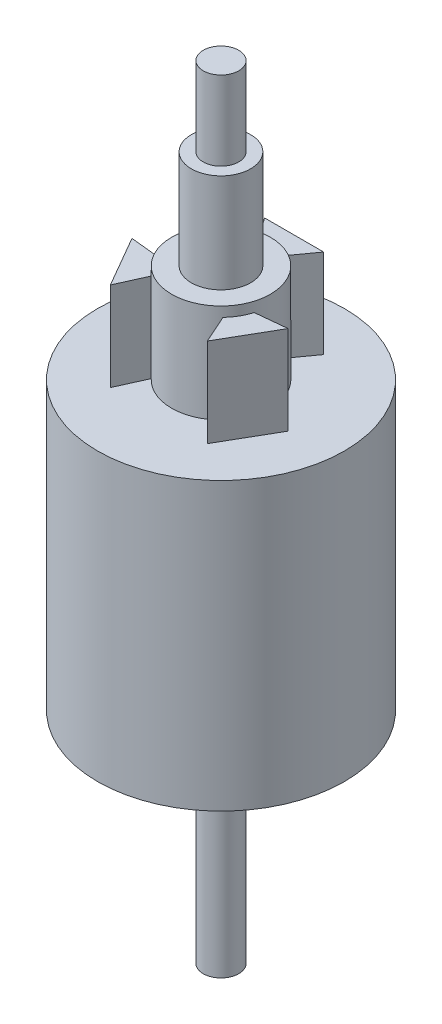
ISO-10303-21;
HEADER;
FILE_DESCRIPTION(('STEP AP214'),'2;1');
FILE_NAME('part.step','',(''),(''),'','','');
FILE_SCHEMA(('AUTOMOTIVE_DESIGN { 1 0 10303 214 1 1 1 1 }'));
ENDSEC;
DATA;
#1=APPLICATION_CONTEXT('core data for automotive mechanical design processes');
#2=APPLICATION_PROTOCOL_DEFINITION('international standard','automotive_design',2000,#1);
#3=PRODUCT_CONTEXT('',#1,'mechanical');
#4=PRODUCT('Part','Part','',(#3));
#5=PRODUCT_RELATED_PRODUCT_CATEGORY('part','',(#4));
#6=PRODUCT_DEFINITION_FORMATION('','',#4);
#7=PRODUCT_DEFINITION_CONTEXT('part definition',#1,'design');
#8=PRODUCT_DEFINITION('design','',#6,#7);
#9=PRODUCT_DEFINITION_SHAPE('','',#8);
#10=(LENGTH_UNIT() NAMED_UNIT(*) SI_UNIT(.MILLI.,.METRE.));
#11=(NAMED_UNIT(*) PLANE_ANGLE_UNIT() SI_UNIT($,.RADIAN.));
#12=(NAMED_UNIT(*) SI_UNIT($,.STERADIAN.) SOLID_ANGLE_UNIT());
#13=UNCERTAINTY_MEASURE_WITH_UNIT(LENGTH_MEASURE(1.E-05),#10,'distance_accuracy_value','');
#14=(GEOMETRIC_REPRESENTATION_CONTEXT(3) GLOBAL_UNCERTAINTY_ASSIGNED_CONTEXT((#13)) GLOBAL_UNIT_ASSIGNED_CONTEXT((#10,
#11,#12)) REPRESENTATION_CONTEXT('',''));
#15=CARTESIAN_POINT('',(0.,0.,0.));
#16=DIRECTION('',(0.,0.,1.));
#17=DIRECTION('',(1.,0.,0.));
#18=AXIS2_PLACEMENT_3D('',#15,#16,#17);
#19=CARTESIAN_POINT('',(0.,14.5,0.));
#20=DIRECTION('',(0.,1.,0.));
#21=DIRECTION('',(0.,0.,1.));
#22=AXIS2_PLACEMENT_3D('',#19,#20,#21);
#23=PLANE('',#22);
#24=CARTESIAN_POINT('',(0.,14.5,0.));
#25=DIRECTION('',(0.,1.,0.));
#26=DIRECTION('',(0.,0.,1.));
#27=AXIS2_PLACEMENT_3D('',#24,#25,#26);
#28=CIRCLE('',#27,6.25);
#29=CARTESIAN_POINT('',(0.,14.5,-6.25));
#30=VERTEX_POINT('',#29);
#31=EDGE_CURVE('E265',#30,#30,#28,.T.);
#32=ORIENTED_EDGE('',*,*,#31,.T.);
#33=EDGE_LOOP('',(#32));
#34=FACE_BOUND('',#33,.T.);
#35=DIRECTION('',(0.499999999999992,0.,-0.866025403784443));
#36=VECTOR('',#35,1.);
#37=CARTESIAN_POINT('',(3.95257779165309,14.5,0.555392899447305));
#38=LINE('',#37,#36);
#39=CARTESIAN_POINT('',(2.45727325582946,14.5,3.14533632828207));
#40=VERTEX_POINT('',#39);
#41=CARTESIAN_POINT('',(3.95257779165309,14.5,0.555392899447305));
#42=VERTEX_POINT('',#41);
#43=EDGE_CURVE('E501',#40,#42,#38,.T.);
#44=ORIENTED_EDGE('',*,*,#43,.F.);
#45=DIRECTION('',(0.409580589376543,0.,0.912273939563092));
#46=VECTOR('',#45,1.);
#47=CARTESIAN_POINT('',(1.81635794236398,14.5,1.71780203318406));
#48=LINE('',#47,#46);
#49=CARTESIAN_POINT('',(1.81635794236398,14.5,1.71780203318406));
#50=VERTEX_POINT('',#49);
#51=EDGE_CURVE('E523',#50,#40,#48,.T.);
#52=ORIENTED_EDGE('',*,*,#51,.F.);
#53=CARTESIAN_POINT('',(0.,14.5,0.));
#54=DIRECTION('',(0.,1.,0.));
#55=DIRECTION('',(0.,0.,1.));
#56=AXIS2_PLACEMENT_3D('',#53,#54,#55);
#57=CIRCLE('',#56,2.5);
#58=CARTESIAN_POINT('',(-1.81635794236396,14.5,1.71780203318409));
#59=VERTEX_POINT('',#58);
#60=EDGE_CURVE('E156',#59,#50,#57,.T.);
#61=ORIENTED_EDGE('',*,*,#60,.F.);
#62=DIRECTION('',(0.40958058937653,0.,-0.912273939563098));
#63=VECTOR('',#62,1.);
#64=CARTESIAN_POINT('',(-1.81635794236396,14.5,1.71780203318409));
#65=LINE('',#64,#63);
#66=CARTESIAN_POINT('',(-2.45727325582942,14.5,3.1453363282821));
#67=VERTEX_POINT('',#66);
#68=EDGE_CURVE('E173',#67,#59,#65,.T.);
#69=ORIENTED_EDGE('',*,*,#68,.F.);
#70=DIRECTION('',(0.500000000000004,0.,0.866025403784436));
#71=VECTOR('',#70,1.);
#72=CARTESIAN_POINT('',(-2.45727325582942,14.5,3.1453363282821));
#73=LINE('',#72,#71);
#74=CARTESIAN_POINT('',(-3.95257779165308,14.5,0.55539289944736));
#75=VERTEX_POINT('',#74);
#76=EDGE_CURVE('E162',#75,#67,#73,.T.);
#77=ORIENTED_EDGE('',*,*,#76,.F.);
#78=DIRECTION('',(-0.994842701560418,0.,-0.101429774484462));
#79=VECTOR('',#78,1.);
#80=CARTESIAN_POINT('',(-2.39583917059195,14.5,0.714111103860797));
#81=LINE('',#80,#79);
#82=CARTESIAN_POINT('',(-2.39583917059195,14.5,0.714111103860797));
#83=VERTEX_POINT('',#82);
#84=EDGE_CURVE('E158',#83,#75,#81,.T.);
#85=ORIENTED_EDGE('',*,*,#84,.F.);
#86=CARTESIAN_POINT('',(-0.579481228227988,14.5,-2.43191313704486));
#87=VERTEX_POINT('',#86);
#88=EDGE_CURVE('E250',#87,#83,#57,.T.);
#89=ORIENTED_EDGE('',*,*,#88,.F.);
#90=DIRECTION('',(0.585262112183883,0.,0.810844165078629));
#91=VECTOR('',#90,1.);
#92=CARTESIAN_POINT('',(-0.579481228227988,14.5,-2.43191313704486));
#93=LINE('',#92,#91);
#94=CARTESIAN_POINT('',(-1.49530453582365,14.5,-3.70072922772943));
#95=VERTEX_POINT('',#94);
#96=EDGE_CURVE('E205',#95,#87,#93,.T.);
#97=ORIENTED_EDGE('',*,*,#96,.F.);
#98=DIRECTION('',(-1.,0.,0.));
#99=VECTOR('',#98,1.);
#100=CARTESIAN_POINT('',(-1.49530453582365,14.5,-3.70072922772943));
#101=LINE('',#100,#99);
#102=CARTESIAN_POINT('',(1.49530453582365,14.5,-3.70072922772943));
#103=VERTEX_POINT('',#102);
#104=EDGE_CURVE('E218',#103,#95,#101,.T.);
#105=ORIENTED_EDGE('',*,*,#104,.F.);
#106=DIRECTION('',(0.585262112183883,0.,-0.810844165078629));
#107=VECTOR('',#106,1.);
#108=CARTESIAN_POINT('',(0.579481228227988,14.5,-2.43191313704486));
#109=LINE('',#108,#107);
#110=CARTESIAN_POINT('',(0.579481228227988,14.5,-2.43191313704486));
#111=VERTEX_POINT('',#110);
#112=EDGE_CURVE('E199',#111,#103,#109,.T.);
#113=ORIENTED_EDGE('',*,*,#112,.F.);
#114=CARTESIAN_POINT('',(2.39583917059196,14.5,0.714111103860764));
#115=VERTEX_POINT('',#114);
#116=EDGE_CURVE('E258',#115,#111,#57,.T.);
#117=ORIENTED_EDGE('',*,*,#116,.F.);
#118=DIRECTION('',(-0.994842701560417,0.,0.101429774484476));
#119=VECTOR('',#118,1.);
#120=CARTESIAN_POINT('',(2.39583917059196,14.5,0.714111103860764));
#121=LINE('',#120,#119);
#122=EDGE_CURVE('E151',#42,#115,#121,.T.);
#123=ORIENTED_EDGE('',*,*,#122,.F.);
#124=EDGE_LOOP('',(#44,#52,#61,#69,#77,#85,#89,#97,#105,#113,#117,#123));
#125=FACE_BOUND('',#124,.T.);
#126=ADVANCED_FACE('F39',(#34,#125),#23,.T.);
#127=CARTESIAN_POINT('',(0.,19.5,0.));
#128=DIRECTION('',(0.,-1.,0.));
#129=DIRECTION('',(0.,0.,-1.));
#130=AXIS2_PLACEMENT_3D('',#127,#128,#129);
#131=CYLINDRICAL_SURFACE('',#130,2.5);
#132=CARTESIAN_POINT('',(0.,19.5,0.));
#133=DIRECTION('',(0.,1.,0.));
#134=DIRECTION('',(0.,0.,1.));
#135=AXIS2_PLACEMENT_3D('',#132,#133,#134);
#136=CIRCLE('',#135,2.5);
#137=CARTESIAN_POINT('',(0.,19.5,2.5));
#138=VERTEX_POINT('',#137);
#139=EDGE_CURVE('E246',#138,#138,#136,.T.);
#140=ORIENTED_EDGE('',*,*,#139,.F.);
#141=EDGE_LOOP('',(#140));
#142=FACE_BOUND('',#141,.T.);
#143=DIRECTION('',(0.,-1.,0.));
#144=VECTOR('',#143,1.);
#145=CARTESIAN_POINT('',(1.81635794236398,19.,1.71780203318406));
#146=LINE('',#145,#144);
#147=CARTESIAN_POINT('',(1.81635794236398,19.,1.71780203318406));
#148=VERTEX_POINT('',#147);
#149=EDGE_CURVE('E136',#148,#50,#146,.T.);
#150=ORIENTED_EDGE('',*,*,#149,.F.);
#151=CARTESIAN_POINT('',(0.,19.,0.));
#152=DIRECTION('',(0.,-1.,0.));
#153=DIRECTION('',(-0.866025403784443,0.,-0.499999999999992));
#154=AXIS2_PLACEMENT_3D('',#151,#152,#153);
#155=CIRCLE('',#154,2.50000000000007);
#156=CARTESIAN_POINT('',(2.39583917059196,19.,0.714111103860764));
#157=VERTEX_POINT('',#156);
#158=EDGE_CURVE('E144',#157,#148,#155,.T.);
#159=ORIENTED_EDGE('',*,*,#158,.F.);
#160=DIRECTION('',(0.,-1.,0.));
#161=VECTOR('',#160,1.);
#162=CARTESIAN_POINT('',(2.39583917059196,19.,0.714111103860764));
#163=LINE('',#162,#161);
#164=EDGE_CURVE('E57',#157,#115,#163,.T.);
#165=ORIENTED_EDGE('',*,*,#164,.T.);
#166=ORIENTED_EDGE('',*,*,#116,.T.);
#167=DIRECTION('',(0.,-1.,0.));
#168=VECTOR('',#167,1.);
#169=CARTESIAN_POINT('',(0.579481228227988,19.,-2.43191313704486));
#170=LINE('',#169,#168);
#171=CARTESIAN_POINT('',(0.579481228227988,19.,-2.43191313704486));
#172=VERTEX_POINT('',#171);
#173=EDGE_CURVE('E234',#172,#111,#170,.T.);
#174=ORIENTED_EDGE('',*,*,#173,.F.);
#175=CARTESIAN_POINT('',(0.,19.,0.));
#176=DIRECTION('',(0.,-1.,0.));
#177=DIRECTION('',(0.,0.,1.));
#178=AXIS2_PLACEMENT_3D('',#175,#176,#177);
#179=CIRCLE('',#178,2.50000000000007);
#180=CARTESIAN_POINT('',(-0.579481228227988,19.,-2.43191313704486));
#181=VERTEX_POINT('',#180);
#182=EDGE_CURVE('E200',#181,#172,#179,.T.);
#183=ORIENTED_EDGE('',*,*,#182,.F.);
#184=DIRECTION('',(0.,-1.,0.));
#185=VECTOR('',#184,1.);
#186=CARTESIAN_POINT('',(-0.579481228227988,19.,-2.43191313704486));
#187=LINE('',#186,#185);
#188=EDGE_CURVE('E215',#181,#87,#187,.T.);
#189=ORIENTED_EDGE('',*,*,#188,.T.);
#190=ORIENTED_EDGE('',*,*,#88,.T.);
#191=DIRECTION('',(0.,-1.,0.));
#192=VECTOR('',#191,1.);
#193=CARTESIAN_POINT('',(-2.39583917059195,19.,0.714111103860797));
#194=LINE('',#193,#192);
#195=CARTESIAN_POINT('',(-2.39583917059195,19.,0.714111103860797));
#196=VERTEX_POINT('',#195);
#197=EDGE_CURVE('E196',#196,#83,#194,.T.);
#198=ORIENTED_EDGE('',*,*,#197,.F.);
#199=CARTESIAN_POINT('',(0.,19.,0.));
#200=DIRECTION('',(0.,-1.,0.));
#201=DIRECTION('',(0.866025403784436,0.,-0.500000000000004));
#202=AXIS2_PLACEMENT_3D('',#199,#200,#201);
#203=CIRCLE('',#202,2.50000000000007);
#204=CARTESIAN_POINT('',(-1.81635794236396,19.,1.71780203318409));
#205=VERTEX_POINT('',#204);
#206=EDGE_CURVE('E168',#205,#196,#203,.T.);
#207=ORIENTED_EDGE('',*,*,#206,.F.);
#208=DIRECTION('',(0.,-1.,0.));
#209=VECTOR('',#208,1.);
#210=CARTESIAN_POINT('',(-1.81635794236396,19.,1.71780203318409));
#211=LINE('',#210,#209);
#212=EDGE_CURVE('E65',#205,#59,#211,.T.);
#213=ORIENTED_EDGE('',*,*,#212,.T.);
#214=ORIENTED_EDGE('',*,*,#60,.T.);
#215=EDGE_LOOP('',(#150,#159,#165,#166,#174,#183,#189,#190,#198,#207,#213,#214));
#216=FACE_BOUND('',#215,.T.);
#217=ADVANCED_FACE('F154',(#142,#216),#131,.T.);
#218=CARTESIAN_POINT('',(0.,14.5,0.));
#219=DIRECTION('',(0.,-1.,0.));
#220=DIRECTION('',(0.,0.,-1.));
#221=AXIS2_PLACEMENT_3D('',#218,#219,#220);
#222=CYLINDRICAL_SURFACE('',#221,6.25);
#223=CARTESIAN_POINT('',(0.,0.,0.));
#224=DIRECTION('',(0.,1.,0.));
#225=DIRECTION('',(0.,0.,1.));
#226=AXIS2_PLACEMENT_3D('',#223,#224,#225);
#227=CIRCLE('',#226,6.25);
#228=CARTESIAN_POINT('',(0.,0.,-6.25));
#229=VERTEX_POINT('',#228);
#230=EDGE_CURVE('E43',#229,#229,#227,.T.);
#231=CARTESIAN_POINT('',(0.,14.5,-6.25));
#232=CARTESIAN_POINT('',(0.,14.3489583333333,-6.25));
#233=CARTESIAN_POINT('',(0.,14.1979166666667,-6.25));
#234=CARTESIAN_POINT('',(0.,13.8958333333333,-6.25));
#235=CARTESIAN_POINT('',(0.,13.7447916666667,-6.25));
#236=CARTESIAN_POINT('',(0.,13.4427083333333,-6.25));
#237=CARTESIAN_POINT('',(0.,13.2916666666667,-6.25));
#238=CARTESIAN_POINT('',(0.,12.9895833333333,-6.25));
#239=CARTESIAN_POINT('',(0.,12.8385416666667,-6.25));
#240=CARTESIAN_POINT('',(0.,12.5364583333333,-6.25));
#241=CARTESIAN_POINT('',(0.,12.3854166666667,-6.25));
#242=CARTESIAN_POINT('',(0.,12.0833333333333,-6.25));
#243=CARTESIAN_POINT('',(0.,11.9322916666667,-6.25));
#244=CARTESIAN_POINT('',(0.,11.6302083333333,-6.25));
#245=CARTESIAN_POINT('',(0.,11.4791666666667,-6.25));
#246=CARTESIAN_POINT('',(0.,11.1770833333333,-6.25));
#247=CARTESIAN_POINT('',(0.,11.0260416666667,-6.25));
#248=CARTESIAN_POINT('',(0.,10.7239583333333,-6.25));
#249=CARTESIAN_POINT('',(0.,10.5729166666667,-6.25));
#250=CARTESIAN_POINT('',(0.,10.2708333333333,-6.25));
#251=CARTESIAN_POINT('',(0.,10.1197916666667,-6.25));
#252=CARTESIAN_POINT('',(0.,9.81770833333333,-6.25));
#253=CARTESIAN_POINT('',(0.,9.66666666666667,-6.25));
#254=CARTESIAN_POINT('',(0.,9.36458333333333,-6.25));
#255=CARTESIAN_POINT('',(0.,9.21354166666667,-6.25));
#256=CARTESIAN_POINT('',(0.,8.91145833333333,-6.25));
#257=CARTESIAN_POINT('',(0.,8.76041666666667,-6.25));
#258=CARTESIAN_POINT('',(0.,8.45833333333333,-6.25));
#259=CARTESIAN_POINT('',(0.,8.30729166666667,-6.25));
#260=CARTESIAN_POINT('',(0.,8.00520833333333,-6.25));
#261=CARTESIAN_POINT('',(0.,7.85416666666667,-6.25));
#262=CARTESIAN_POINT('',(0.,7.55208333333333,-6.25));
#263=CARTESIAN_POINT('',(0.,7.40104166666667,-6.25));
#264=CARTESIAN_POINT('',(0.,7.09895833333333,-6.25));
#265=CARTESIAN_POINT('',(0.,6.94791666666667,-6.25));
#266=CARTESIAN_POINT('',(0.,6.64583333333333,-6.25));
#267=CARTESIAN_POINT('',(0.,6.49479166666667,-6.25));
#268=CARTESIAN_POINT('',(0.,6.19270833333333,-6.25));
#269=CARTESIAN_POINT('',(0.,6.04166666666667,-6.25));
#270=CARTESIAN_POINT('',(0.,5.73958333333333,-6.25));
#271=CARTESIAN_POINT('',(0.,5.58854166666667,-6.25));
#272=CARTESIAN_POINT('',(0.,5.28645833333333,-6.25));
#273=CARTESIAN_POINT('',(0.,5.13541666666667,-6.25));
#274=CARTESIAN_POINT('',(0.,4.83333333333333,-6.25));
#275=CARTESIAN_POINT('',(0.,4.68229166666667,-6.25));
#276=CARTESIAN_POINT('',(0.,4.38020833333333,-6.25));
#277=CARTESIAN_POINT('',(0.,4.22916666666667,-6.25));
#278=CARTESIAN_POINT('',(0.,3.92708333333333,-6.25));
#279=CARTESIAN_POINT('',(0.,3.77604166666667,-6.25));
#280=CARTESIAN_POINT('',(0.,3.47395833333333,-6.25));
#281=CARTESIAN_POINT('',(0.,3.32291666666667,-6.25));
#282=CARTESIAN_POINT('',(0.,3.02083333333333,-6.25));
#283=CARTESIAN_POINT('',(0.,2.86979166666667,-6.25));
#284=CARTESIAN_POINT('',(0.,2.56770833333333,-6.25));
#285=CARTESIAN_POINT('',(0.,2.41666666666667,-6.25));
#286=CARTESIAN_POINT('',(0.,2.11458333333333,-6.25));
#287=CARTESIAN_POINT('',(0.,1.96354166666667,-6.25));
#288=CARTESIAN_POINT('',(0.,1.66145833333333,-6.25));
#289=CARTESIAN_POINT('',(0.,1.51041666666667,-6.25));
#290=CARTESIAN_POINT('',(0.,1.20833333333333,-6.25));
#291=CARTESIAN_POINT('',(0.,1.05729166666667,-6.25));
#292=CARTESIAN_POINT('',(0.,0.755208333333334,-6.25));
#293=CARTESIAN_POINT('',(0.,0.604166666666667,-6.25));
#294=CARTESIAN_POINT('',(0.,0.302083333333333,-6.25));
#295=CARTESIAN_POINT('',(0.,0.151041666666667,-6.25));
#296=CARTESIAN_POINT('',(0.,0.,-6.25));
#297=B_SPLINE_CURVE_WITH_KNOTS('',3,(#231,#232,#233,#234,#235,#236,#237,#238,#239,#240,#241,
#242,#243,#244,#245,#246,#247,#248,#249,#250,#251,#252,#253,#254,#255,#256,#257,#258,#259,#260,
#261,#262,#263,#264,#265,#266,#267,#268,#269,#270,#271,#272,#273,#274,#275,#276,#277,#278,#279,
#280,#281,#282,#283,#284,#285,#286,#287,#288,#289,#290,#291,#292,#293,#294,#295,#296),
.UNSPECIFIED.,.F.,.F.,(4,2,2,2,2,2,2,2,2,2,2,2,2,2,2,2,2,2,2,2,2,2,2,2,2,2,2,2,2,2,2,2,4),(0.,
0.453125,0.906250000000001,1.359375,1.8125,2.265625,2.71875,3.171875,3.625,4.078125,4.53125,
4.984375,5.4375,5.890625,6.34375,6.796875,7.25,7.703125,8.15625,8.609375,9.0625,9.515625,
9.96875,10.421875,10.875,11.328125,11.78125,12.234375,12.6875,13.140625,13.59375,14.046875,
14.5),.UNSPECIFIED.);
#298=EDGE_CURVE('BSEAM41',#30,#229,#297,.T.);
#299=ORIENTED_EDGE('',*,*,#31,.F.);
#300=ORIENTED_EDGE('',*,*,#230,.T.);
#301=ORIENTED_EDGE('',*,*,#298,.T.);
#302=ORIENTED_EDGE('',*,*,#298,.F.);
#303=EDGE_LOOP('',(#299,#301,#300,#302));
#304=FACE_BOUND('',#303,.T.);
#305=ADVANCED_FACE('F41',(#304),#222,.T.);
#306=CARTESIAN_POINT('',(0.,0.,0.));
#307=DIRECTION('',(0.,1.,0.));
#308=DIRECTION('',(0.,0.,1.));
#309=AXIS2_PLACEMENT_3D('',#306,#307,#308);
#310=PLANE('',#309);
#311=CARTESIAN_POINT('',(0.,0.,0.));
#312=DIRECTION('',(0.,1.,0.));
#313=DIRECTION('',(0.,0.,1.));
#314=AXIS2_PLACEMENT_3D('',#311,#312,#313);
#315=CIRCLE('',#314,0.9);
#316=CARTESIAN_POINT('',(0.,0.,0.9));
#317=VERTEX_POINT('',#316);
#318=EDGE_CURVE('E254',#317,#317,#315,.T.);
#319=ORIENTED_EDGE('',*,*,#318,.T.);
#320=EDGE_LOOP('',(#319));
#321=FACE_BOUND('',#320,.T.);
#322=ORIENTED_EDGE('',*,*,#230,.F.);
#323=EDGE_LOOP('',(#322));
#324=FACE_BOUND('',#323,.T.);
#325=ADVANCED_FACE('F276',(#321,#324),#310,.F.);
#326=CARTESIAN_POINT('',(0.,-11.1,0.));
#327=DIRECTION('',(0.,1.,0.));
#328=DIRECTION('',(0.,0.,1.));
#329=AXIS2_PLACEMENT_3D('',#326,#327,#328);
#330=CYLINDRICAL_SURFACE('',#329,0.9);
#331=CARTESIAN_POINT('',(0.,-11.1,0.));
#332=DIRECTION('',(0.,1.,0.));
#333=DIRECTION('',(0.,0.,1.));
#334=AXIS2_PLACEMENT_3D('',#331,#332,#333);
#335=CIRCLE('',#334,0.9);
#336=CARTESIAN_POINT('',(0.,-11.1,0.9));
#337=VERTEX_POINT('',#336);
#338=EDGE_CURVE('E259',#337,#337,#335,.T.);
#339=ORIENTED_EDGE('',*,*,#338,.T.);
#340=EDGE_LOOP('',(#339));
#341=FACE_BOUND('',#340,.T.);
#342=ORIENTED_EDGE('',*,*,#318,.F.);
#343=EDGE_LOOP('',(#342));
#344=FACE_BOUND('',#343,.T.);
#345=ADVANCED_FACE('F278',(#341,#344),#330,.T.);
#346=CARTESIAN_POINT('',(0.,-11.1,0.));
#347=DIRECTION('',(0.,1.,0.));
#348=DIRECTION('',(0.,0.,1.));
#349=AXIS2_PLACEMENT_3D('',#346,#347,#348);
#350=PLANE('',#349);
#351=ORIENTED_EDGE('',*,*,#338,.F.);
#352=EDGE_LOOP('',(#351));
#353=FACE_BOUND('',#352,.T.);
#354=ADVANCED_FACE('F284',(#353),#350,.F.);
#355=CARTESIAN_POINT('',(0.,19.5,0.));
#356=DIRECTION('',(0.,1.,0.));
#357=DIRECTION('',(0.,0.,1.));
#358=AXIS2_PLACEMENT_3D('',#355,#356,#357);
#359=PLANE('',#358);
#360=CARTESIAN_POINT('',(0.,19.5,0.));
#361=DIRECTION('',(0.,1.,0.));
#362=DIRECTION('',(0.,0.,1.));
#363=AXIS2_PLACEMENT_3D('',#360,#361,#362);
#364=CIRCLE('',#363,1.5);
#365=CARTESIAN_POINT('',(0.,19.5,1.5));
#366=VERTEX_POINT('',#365);
#367=EDGE_CURVE('E49',#366,#366,#364,.T.);
#368=ORIENTED_EDGE('',*,*,#367,.F.);
#369=EDGE_LOOP('',(#368));
#370=FACE_BOUND('',#369,.T.);
#371=ORIENTED_EDGE('',*,*,#139,.T.);
#372=EDGE_LOOP('',(#371));
#373=FACE_BOUND('',#372,.T.);
#374=ADVANCED_FACE('F299',(#370,#373),#359,.T.);
#375=CARTESIAN_POINT('',(0.,24.5,0.));
#376=DIRECTION('',(0.,-1.,0.));
#377=DIRECTION('',(0.,0.,-1.));
#378=AXIS2_PLACEMENT_3D('',#375,#376,#377);
#379=CYLINDRICAL_SURFACE('',#378,1.5);
#380=CARTESIAN_POINT('',(0.,24.5,0.));
#381=DIRECTION('',(0.,1.,0.));
#382=DIRECTION('',(0.,0.,1.));
#383=AXIS2_PLACEMENT_3D('',#380,#381,#382);
#384=CIRCLE('',#383,1.5);
#385=CARTESIAN_POINT('',(0.,24.5,1.5));
#386=VERTEX_POINT('',#385);
#387=EDGE_CURVE('E241',#386,#386,#384,.T.);
#388=ORIENTED_EDGE('',*,*,#387,.F.);
#389=EDGE_LOOP('',(#388));
#390=FACE_BOUND('',#389,.T.);
#391=ORIENTED_EDGE('',*,*,#367,.T.);
#392=EDGE_LOOP('',(#391));
#393=FACE_BOUND('',#392,.T.);
#394=ADVANCED_FACE('F304',(#390,#393),#379,.T.);
#395=CARTESIAN_POINT('',(0.,24.5,0.));
#396=DIRECTION('',(0.,1.,0.));
#397=DIRECTION('',(0.,0.,1.));
#398=AXIS2_PLACEMENT_3D('',#395,#396,#397);
#399=PLANE('',#398);
#400=CARTESIAN_POINT('',(0.,24.5,0.));
#401=DIRECTION('',(0.,1.,0.));
#402=DIRECTION('',(0.,0.,1.));
#403=AXIS2_PLACEMENT_3D('',#400,#401,#402);
#404=CIRCLE('',#403,0.9);
#405=CARTESIAN_POINT('',(0.,24.5,0.9));
#406=VERTEX_POINT('',#405);
#407=EDGE_CURVE('E11',#406,#406,#404,.T.);
#408=ORIENTED_EDGE('',*,*,#407,.F.);
#409=EDGE_LOOP('',(#408));
#410=FACE_BOUND('',#409,.T.);
#411=ORIENTED_EDGE('',*,*,#387,.T.);
#412=EDGE_LOOP('',(#411));
#413=FACE_BOUND('',#412,.T.);
#414=ADVANCED_FACE('F308',(#410,#413),#399,.T.);
#415=CARTESIAN_POINT('',(0.,28.5,0.));
#416=DIRECTION('',(0.,-1.,0.));
#417=DIRECTION('',(0.,0.,-1.));
#418=AXIS2_PLACEMENT_3D('',#415,#416,#417);
#419=CYLINDRICAL_SURFACE('',#418,0.9);
#420=CARTESIAN_POINT('',(0.,28.5,0.));
#421=DIRECTION('',(0.,1.,0.));
#422=DIRECTION('',(0.,0.,1.));
#423=AXIS2_PLACEMENT_3D('',#420,#421,#422);
#424=CIRCLE('',#423,0.9);
#425=CARTESIAN_POINT('',(0.,28.5,0.9));
#426=VERTEX_POINT('',#425);
#427=EDGE_CURVE('E238',#426,#426,#424,.T.);
#428=ORIENTED_EDGE('',*,*,#427,.F.);
#429=EDGE_LOOP('',(#428));
#430=FACE_BOUND('',#429,.T.);
#431=ORIENTED_EDGE('',*,*,#407,.T.);
#432=EDGE_LOOP('',(#431));
#433=FACE_BOUND('',#432,.T.);
#434=ADVANCED_FACE('F312',(#430,#433),#419,.T.);
#435=CARTESIAN_POINT('',(0.,28.5,0.));
#436=DIRECTION('',(0.,1.,0.));
#437=DIRECTION('',(0.,0.,1.));
#438=AXIS2_PLACEMENT_3D('',#435,#436,#437);
#439=PLANE('',#438);
#440=ORIENTED_EDGE('',*,*,#427,.T.);
#441=EDGE_LOOP('',(#440));
#442=FACE_BOUND('',#441,.T.);
#443=ADVANCED_FACE('F316',(#442),#439,.T.);
#444=CARTESIAN_POINT('',(0.579481228227988,19.,-2.43191313704486));
#445=DIRECTION('',(-0.810844165078629,0.,-0.585262112183883));
#446=DIRECTION('',(-0.585262112183883,0.,0.810844165078629));
#447=AXIS2_PLACEMENT_3D('',#444,#445,#446);
#448=PLANE('',#447);
#449=ORIENTED_EDGE('',*,*,#112,.T.);
#450=DIRECTION('',(0.,-1.,0.));
#451=VECTOR('',#450,1.);
#452=CARTESIAN_POINT('',(1.49530453582365,19.,-3.70072922772943));
#453=LINE('',#452,#451);
#454=CARTESIAN_POINT('',(1.49530453582365,19.,-3.70072922772943));
#455=VERTEX_POINT('',#454);
#456=EDGE_CURVE('E230',#455,#103,#453,.T.);
#457=ORIENTED_EDGE('',*,*,#456,.F.);
#458=DIRECTION('',(0.585262112183883,0.,-0.810844165078629));
#459=VECTOR('',#458,1.);
#460=CARTESIAN_POINT('',(0.579481228227988,19.,-2.43191313704486));
#461=LINE('',#460,#459);
#462=EDGE_CURVE('E204',#172,#455,#461,.T.);
#463=ORIENTED_EDGE('',*,*,#462,.F.);
#464=ORIENTED_EDGE('',*,*,#173,.T.);
#465=EDGE_LOOP('',(#449,#457,#463,#464));
#466=FACE_BOUND('',#465,.T.);
#467=ADVANCED_FACE('F320',(#466),#448,.F.);
#468=CARTESIAN_POINT('',(-1.49530453582365,19.,-3.70072922772943));
#469=DIRECTION('',(0.,0.,1.));
#470=DIRECTION('',(1.,0.,0.));
#471=AXIS2_PLACEMENT_3D('',#468,#469,#470);
#472=PLANE('',#471);
#473=ORIENTED_EDGE('',*,*,#104,.T.);
#474=DIRECTION('',(0.,-1.,0.));
#475=VECTOR('',#474,1.);
#476=CARTESIAN_POINT('',(-1.49530453582365,19.,-3.70072922772943));
#477=LINE('',#476,#475);
#478=CARTESIAN_POINT('',(-1.49530453582365,19.,-3.70072922772943));
#479=VERTEX_POINT('',#478);
#480=EDGE_CURVE('E226',#479,#95,#477,.T.);
#481=ORIENTED_EDGE('',*,*,#480,.F.);
#482=DIRECTION('',(-1.,0.,0.));
#483=VECTOR('',#482,1.);
#484=CARTESIAN_POINT('',(-1.49530453582365,19.,-3.70072922772943));
#485=LINE('',#484,#483);
#486=EDGE_CURVE('E208',#455,#479,#485,.T.);
#487=ORIENTED_EDGE('',*,*,#486,.F.);
#488=ORIENTED_EDGE('',*,*,#456,.T.);
#489=EDGE_LOOP('',(#473,#481,#487,#488));
#490=FACE_BOUND('',#489,.T.);
#491=ADVANCED_FACE('F324',(#490),#472,.F.);
#492=CARTESIAN_POINT('',(-0.579481228227988,19.,-2.43191313704486));
#493=DIRECTION('',(0.810844165078629,0.,-0.585262112183883));
#494=DIRECTION('',(-0.585262112183883,0.,-0.810844165078629));
#495=AXIS2_PLACEMENT_3D('',#492,#493,#494);
#496=PLANE('',#495);
#497=ORIENTED_EDGE('',*,*,#96,.T.);
#498=ORIENTED_EDGE('',*,*,#188,.F.);
#499=DIRECTION('',(0.585262112183883,0.,0.810844165078629));
#500=VECTOR('',#499,1.);
#501=CARTESIAN_POINT('',(-0.579481228227988,19.,-2.43191313704486));
#502=LINE('',#501,#500);
#503=EDGE_CURVE('E211',#479,#181,#502,.T.);
#504=ORIENTED_EDGE('',*,*,#503,.F.);
#505=ORIENTED_EDGE('',*,*,#480,.T.);
#506=EDGE_LOOP('',(#497,#498,#504,#505));
#507=FACE_BOUND('',#506,.T.);
#508=ADVANCED_FACE('F328',(#507),#496,.F.);
#509=CARTESIAN_POINT('',(0.,19.,0.));
#510=DIRECTION('',(0.,1.,0.));
#511=DIRECTION('',(0.,0.,1.));
#512=AXIS2_PLACEMENT_3D('',#509,#510,#511);
#513=PLANE('',#512);
#514=ORIENTED_EDGE('',*,*,#182,.T.);
#515=ORIENTED_EDGE('',*,*,#462,.T.);
#516=ORIENTED_EDGE('',*,*,#486,.T.);
#517=ORIENTED_EDGE('',*,*,#503,.T.);
#518=EDGE_LOOP('',(#514,#515,#516,#517));
#519=FACE_BOUND('',#518,.T.);
#520=ADVANCED_FACE('F332',(#519),#513,.T.);
#521=CARTESIAN_POINT('',(-2.39583917059195,19.,0.714111103860797));
#522=DIRECTION('',(-0.101429774484462,0.,0.994842701560418));
#523=DIRECTION('',(0.994842701560418,0.,0.101429774484462));
#524=AXIS2_PLACEMENT_3D('',#521,#522,#523);
#525=PLANE('',#524);
#526=ORIENTED_EDGE('',*,*,#84,.T.);
#527=DIRECTION('',(0.,-1.,0.));
#528=VECTOR('',#527,1.);
#529=CARTESIAN_POINT('',(-3.95257779165308,19.,0.55539289944736));
#530=LINE('',#529,#528);
#531=CARTESIAN_POINT('',(-3.95257779165308,19.,0.55539289944736));
#532=VERTEX_POINT('',#531);
#533=EDGE_CURVE('E192',#532,#75,#530,.T.);
#534=ORIENTED_EDGE('',*,*,#533,.F.);
#535=DIRECTION('',(-0.994842701560418,0.,-0.101429774484462));
#536=VECTOR('',#535,1.);
#537=CARTESIAN_POINT('',(-2.39583917059195,19.,0.714111103860797));
#538=LINE('',#537,#536);
#539=EDGE_CURVE('E172',#196,#532,#538,.T.);
#540=ORIENTED_EDGE('',*,*,#539,.F.);
#541=ORIENTED_EDGE('',*,*,#197,.T.);
#542=EDGE_LOOP('',(#526,#534,#540,#541));
#543=FACE_BOUND('',#542,.T.);
#544=ADVANCED_FACE('F336',(#543),#525,.F.);
#545=CARTESIAN_POINT('',(-2.45727325582942,19.,3.1453363282821));
#546=DIRECTION('',(0.866025403784436,0.,-0.500000000000004));
#547=DIRECTION('',(-0.500000000000004,0.,-0.866025403784436));
#548=AXIS2_PLACEMENT_3D('',#545,#546,#547);
#549=PLANE('',#548);
#550=ORIENTED_EDGE('',*,*,#76,.T.);
#551=DIRECTION('',(0.,-1.,0.));
#552=VECTOR('',#551,1.);
#553=CARTESIAN_POINT('',(-2.45727325582942,19.,3.1453363282821));
#554=LINE('',#553,#552);
#555=CARTESIAN_POINT('',(-2.45727325582942,19.,3.1453363282821));
#556=VERTEX_POINT('',#555);
#557=EDGE_CURVE('E188',#556,#67,#554,.T.);
#558=ORIENTED_EDGE('',*,*,#557,.F.);
#559=DIRECTION('',(0.500000000000004,0.,0.866025403784436));
#560=VECTOR('',#559,1.);
#561=CARTESIAN_POINT('',(-2.45727325582942,19.,3.1453363282821));
#562=LINE('',#561,#560);
#563=EDGE_CURVE('E176',#532,#556,#562,.T.);
#564=ORIENTED_EDGE('',*,*,#563,.F.);
#565=ORIENTED_EDGE('',*,*,#533,.T.);
#566=EDGE_LOOP('',(#550,#558,#564,#565));
#567=FACE_BOUND('',#566,.T.);
#568=ADVANCED_FACE('F340',(#567),#549,.F.);
#569=CARTESIAN_POINT('',(-1.81635794236396,19.,1.71780203318409));
#570=DIRECTION('',(-0.912273939563098,0.,-0.40958058937653));
#571=DIRECTION('',(-0.40958058937653,0.,0.912273939563098));
#572=AXIS2_PLACEMENT_3D('',#569,#570,#571);
#573=PLANE('',#572);
#574=ORIENTED_EDGE('',*,*,#68,.T.);
#575=ORIENTED_EDGE('',*,*,#212,.F.);
#576=DIRECTION('',(0.40958058937653,0.,-0.912273939563098));
#577=VECTOR('',#576,1.);
#578=CARTESIAN_POINT('',(-1.81635794236396,19.,1.71780203318409));
#579=LINE('',#578,#577);
#580=EDGE_CURVE('E179',#556,#205,#579,.T.);
#581=ORIENTED_EDGE('',*,*,#580,.F.);
#582=ORIENTED_EDGE('',*,*,#557,.T.);
#583=EDGE_LOOP('',(#574,#575,#581,#582));
#584=FACE_BOUND('',#583,.T.);
#585=ADVANCED_FACE('F344',(#584),#573,.F.);
#586=CARTESIAN_POINT('',(0.,19.,0.));
#587=DIRECTION('',(0.,1.,0.));
#588=DIRECTION('',(0.866025403784436,0.,-0.500000000000004));
#589=AXIS2_PLACEMENT_3D('',#586,#587,#588);
#590=PLANE('',#589);
#591=ORIENTED_EDGE('',*,*,#206,.T.);
#592=ORIENTED_EDGE('',*,*,#539,.T.);
#593=ORIENTED_EDGE('',*,*,#563,.T.);
#594=ORIENTED_EDGE('',*,*,#580,.T.);
#595=EDGE_LOOP('',(#591,#592,#593,#594));
#596=FACE_BOUND('',#595,.T.);
#597=ADVANCED_FACE('F348',(#596),#590,.T.);
#598=CARTESIAN_POINT('',(1.81635794236398,19.,1.71780203318406));
#599=DIRECTION('',(0.912273939563092,0.,-0.409580589376543));
#600=DIRECTION('',(-0.409580589376543,0.,-0.912273939563092));
#601=AXIS2_PLACEMENT_3D('',#598,#599,#600);
#602=PLANE('',#601);
#603=ORIENTED_EDGE('',*,*,#51,.T.);
#604=DIRECTION('',(0.,-1.,0.));
#605=VECTOR('',#604,1.);
#606=CARTESIAN_POINT('',(2.45727325582946,19.,3.14533632828207));
#607=LINE('',#606,#605);
#608=CARTESIAN_POINT('',(2.45727325582946,19.,3.14533632828207));
#609=VERTEX_POINT('',#608);
#610=EDGE_CURVE('E139',#609,#40,#607,.T.);
#611=ORIENTED_EDGE('',*,*,#610,.F.);
#612=DIRECTION('',(0.409580589376543,0.,0.912273939563092));
#613=VECTOR('',#612,1.);
#614=CARTESIAN_POINT('',(1.81635794236398,19.,1.71780203318406));
#615=LINE('',#614,#613);
#616=EDGE_CURVE('E132',#148,#609,#615,.T.);
#617=ORIENTED_EDGE('',*,*,#616,.F.);
#618=ORIENTED_EDGE('',*,*,#149,.T.);
#619=EDGE_LOOP('',(#603,#611,#617,#618));
#620=FACE_BOUND('',#619,.T.);
#621=ADVANCED_FACE('F134',(#620),#602,.F.);
#622=CARTESIAN_POINT('',(3.95257779165309,19.,0.555392899447305));
#623=DIRECTION('',(-0.866025403784443,0.,-0.499999999999992));
#624=DIRECTION('',(-0.499999999999992,0.,0.866025403784443));
#625=AXIS2_PLACEMENT_3D('',#622,#623,#624);
#626=PLANE('',#625);
#627=ORIENTED_EDGE('',*,*,#43,.T.);
#628=DIRECTION('',(0.,-1.,0.));
#629=VECTOR('',#628,1.);
#630=CARTESIAN_POINT('',(3.95257779165309,19.,0.555392899447305));
#631=LINE('',#630,#629);
#632=CARTESIAN_POINT('',(3.95257779165309,19.,0.555392899447305));
#633=VERTEX_POINT('',#632);
#634=EDGE_CURVE('E164',#633,#42,#631,.T.);
#635=ORIENTED_EDGE('',*,*,#634,.F.);
#636=DIRECTION('',(0.499999999999992,0.,-0.866025403784443));
#637=VECTOR('',#636,1.);
#638=CARTESIAN_POINT('',(3.95257779165309,19.,0.555392899447305));
#639=LINE('',#638,#637);
#640=EDGE_CURVE('E143',#609,#633,#639,.T.);
#641=ORIENTED_EDGE('',*,*,#640,.F.);
#642=ORIENTED_EDGE('',*,*,#610,.T.);
#643=EDGE_LOOP('',(#627,#635,#641,#642));
#644=FACE_BOUND('',#643,.T.);
#645=ADVANCED_FACE('F354',(#644),#626,.F.);
#646=CARTESIAN_POINT('',(2.39583917059196,19.,0.714111103860764));
#647=DIRECTION('',(0.101429774484476,0.,0.994842701560417));
#648=DIRECTION('',(0.994842701560417,0.,-0.101429774484476));
#649=AXIS2_PLACEMENT_3D('',#646,#647,#648);
#650=PLANE('',#649);
#651=ORIENTED_EDGE('',*,*,#122,.T.);
#652=ORIENTED_EDGE('',*,*,#164,.F.);
#653=DIRECTION('',(-0.994842701560417,0.,0.101429774484476));
#654=VECTOR('',#653,1.);
#655=CARTESIAN_POINT('',(2.39583917059196,19.,0.714111103860764));
#656=LINE('',#655,#654);
#657=EDGE_CURVE('E148',#633,#157,#656,.T.);
#658=ORIENTED_EDGE('',*,*,#657,.F.);
#659=ORIENTED_EDGE('',*,*,#634,.T.);
#660=EDGE_LOOP('',(#651,#652,#658,#659));
#661=FACE_BOUND('',#660,.T.);
#662=ADVANCED_FACE('F357',(#661),#650,.F.);
#663=CARTESIAN_POINT('',(0.,19.,0.));
#664=DIRECTION('',(0.,1.,0.));
#665=DIRECTION('',(-0.866025403784443,0.,-0.499999999999992));
#666=AXIS2_PLACEMENT_3D('',#663,#664,#665);
#667=PLANE('',#666);
#668=ORIENTED_EDGE('',*,*,#158,.T.);
#669=ORIENTED_EDGE('',*,*,#616,.T.);
#670=ORIENTED_EDGE('',*,*,#640,.T.);
#671=ORIENTED_EDGE('',*,*,#657,.T.);
#672=EDGE_LOOP('',(#668,#669,#670,#671));
#673=FACE_BOUND('',#672,.T.);
#674=ADVANCED_FACE('F147',(#673),#667,.T.);
#675=CLOSED_SHELL('',(#126,#217,#305,#325,#345,#354,#374,#394,#414,#434,#443,#467,#491,#508,
#520,#544,#568,#585,#597,#621,#645,#662,#674));
#676=MANIFOLD_SOLID_BREP('B2',#675);
#677=ADVANCED_BREP_SHAPE_REPRESENTATION('',(#18,#676),#14);
#678=SHAPE_DEFINITION_REPRESENTATION(#9,#677);
ENDSEC;
END-ISO-10303-21;
